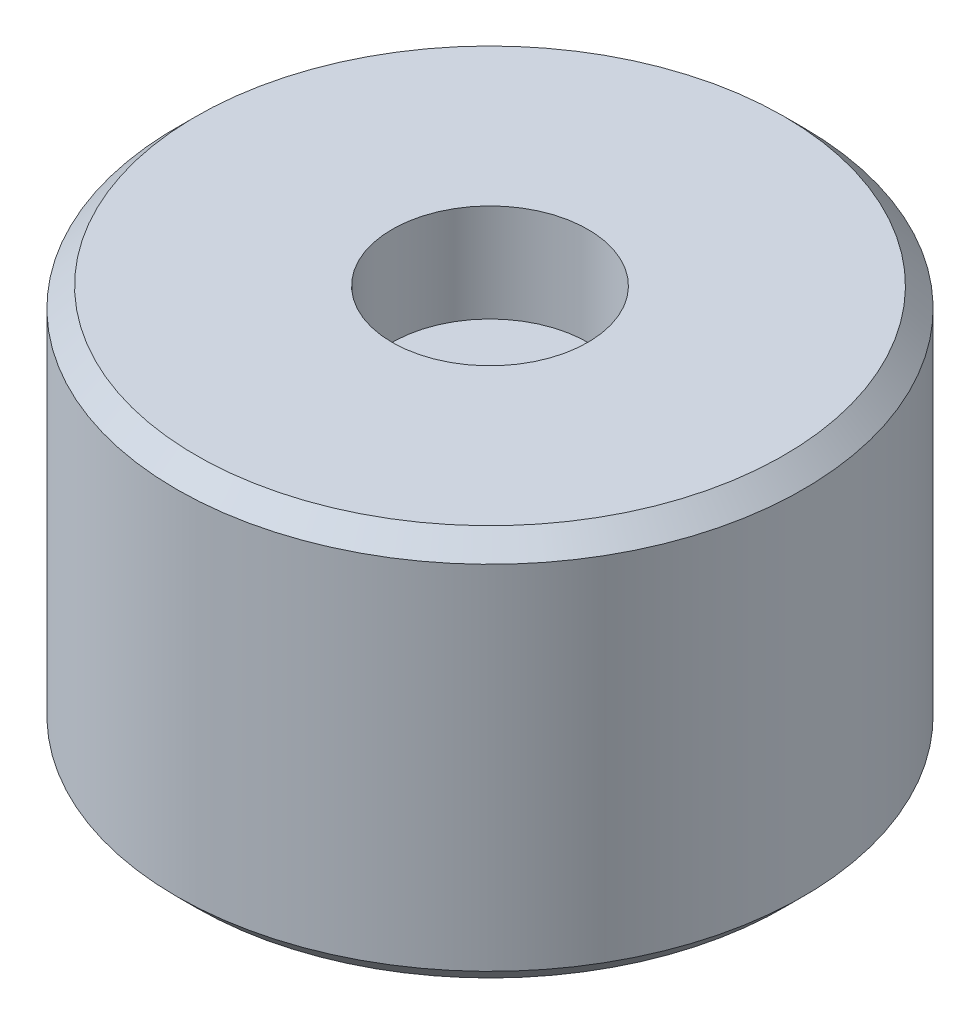
ISO-10303-21;
HEADER;
FILE_DESCRIPTION(('STEP AP214'),'2;1');
FILE_NAME('part.step','',(''),(''),'','','');
FILE_SCHEMA(('AUTOMOTIVE_DESIGN { 1 0 10303 214 1 1 1 1 }'));
ENDSEC;
DATA;
#1=APPLICATION_CONTEXT('core data for automotive mechanical design processes');
#2=APPLICATION_PROTOCOL_DEFINITION('international standard','automotive_design',2000,#1);
#3=PRODUCT_CONTEXT('',#1,'mechanical');
#4=PRODUCT('Part','Part','',(#3));
#5=PRODUCT_RELATED_PRODUCT_CATEGORY('part','',(#4));
#6=PRODUCT_DEFINITION_FORMATION('','',#4);
#7=PRODUCT_DEFINITION_CONTEXT('part definition',#1,'design');
#8=PRODUCT_DEFINITION('design','',#6,#7);
#9=PRODUCT_DEFINITION_SHAPE('','',#8);
#10=(LENGTH_UNIT() NAMED_UNIT(*) SI_UNIT(.MILLI.,.METRE.));
#11=(NAMED_UNIT(*) PLANE_ANGLE_UNIT() SI_UNIT($,.RADIAN.));
#12=(NAMED_UNIT(*) SI_UNIT($,.STERADIAN.) SOLID_ANGLE_UNIT());
#13=UNCERTAINTY_MEASURE_WITH_UNIT(LENGTH_MEASURE(1.E-05),#10,'distance_accuracy_value','');
#14=(GEOMETRIC_REPRESENTATION_CONTEXT(3) GLOBAL_UNCERTAINTY_ASSIGNED_CONTEXT((#13)) GLOBAL_UNIT_ASSIGNED_CONTEXT((#10,
#11,#12)) REPRESENTATION_CONTEXT('',''));
#15=CARTESIAN_POINT('',(0.,0.,0.));
#16=DIRECTION('',(0.,0.,1.));
#17=DIRECTION('',(1.,0.,0.));
#18=AXIS2_PLACEMENT_3D('',#15,#16,#17);
#19=CARTESIAN_POINT('',(0.,4.,0.));
#20=DIRECTION('',(0.,-1.,0.));
#21=DIRECTION('',(0.,0.,-1.));
#22=AXIS2_PLACEMENT_3D('',#19,#20,#21);
#23=CYLINDRICAL_SURFACE('',#22,3.2);
#24=CARTESIAN_POINT('',(0.,0.200000000000001,0.));
#25=DIRECTION('',(0.,1.,0.));
#26=DIRECTION('',(0.,0.,1.));
#27=AXIS2_PLACEMENT_3D('',#24,#25,#26);
#28=CIRCLE('',#27,3.2);
#29=CARTESIAN_POINT('',(0.,0.200000000000001,3.2));
#30=VERTEX_POINT('',#29);
#31=EDGE_CURVE('E148',#30,#30,#28,.T.);
#32=ORIENTED_EDGE('',*,*,#31,.T.);
#33=EDGE_LOOP('',(#32));
#34=FACE_BOUND('',#33,.T.);
#35=CARTESIAN_POINT('',(0.,3.8,0.));
#36=DIRECTION('',(0.,1.,0.));
#37=DIRECTION('',(0.,0.,1.));
#38=AXIS2_PLACEMENT_3D('',#35,#36,#37);
#39=CIRCLE('',#38,3.2);
#40=CARTESIAN_POINT('',(0.,3.8,-3.2));
#41=VERTEX_POINT('',#40);
#42=EDGE_CURVE('E141',#41,#41,#39,.F.);
#43=ORIENTED_EDGE('',*,*,#42,.T.);
#44=EDGE_LOOP('',(#43));
#45=FACE_BOUND('',#44,.T.);
#46=ADVANCED_FACE('F40',(#34,#45),#23,.T.);
#47=CARTESIAN_POINT('',(0.,4.,0.));
#48=DIRECTION('',(0.,1.,0.));
#49=DIRECTION('',(0.,0.,1.));
#50=AXIS2_PLACEMENT_3D('',#47,#48,#49);
#51=PLANE('',#50);
#52=CARTESIAN_POINT('',(0.,4.,0.));
#53=DIRECTION('',(0.,1.,0.));
#54=DIRECTION('',(0.,0.,1.));
#55=AXIS2_PLACEMENT_3D('',#52,#53,#54);
#56=CIRCLE('',#55,1.);
#57=CARTESIAN_POINT('',(0.,4.,1.));
#58=VERTEX_POINT('',#57);
#59=EDGE_CURVE('E132',#58,#58,#56,.T.);
#60=ORIENTED_EDGE('',*,*,#59,.F.);
#61=EDGE_LOOP('',(#60));
#62=FACE_BOUND('',#61,.T.);
#63=CARTESIAN_POINT('',(0.,4.,0.));
#64=DIRECTION('',(0.,1.,0.));
#65=DIRECTION('',(0.,0.,1.));
#66=AXIS2_PLACEMENT_3D('',#63,#64,#65);
#67=CIRCLE('',#66,3.);
#68=CARTESIAN_POINT('',(0.,4.,-3.));
#69=VERTEX_POINT('',#68);
#70=EDGE_CURVE('E11',#69,#69,#67,.T.);
#71=ORIENTED_EDGE('',*,*,#70,.T.);
#72=EDGE_LOOP('',(#71));
#73=FACE_BOUND('',#72,.T.);
#74=ADVANCED_FACE('F164',(#62,#73),#51,.T.);
#75=CARTESIAN_POINT('',(0.,0.,0.));
#76=DIRECTION('',(0.,1.,0.));
#77=DIRECTION('',(0.,0.,1.));
#78=AXIS2_PLACEMENT_3D('',#75,#76,#77);
#79=PLANE('',#78);
#80=CARTESIAN_POINT('',(0.,0.,0.));
#81=DIRECTION('',(0.,-1.,0.));
#82=DIRECTION('',(0.,0.,-1.));
#83=AXIS2_PLACEMENT_3D('',#80,#81,#82);
#84=CIRCLE('',#83,2.8);
#85=CARTESIAN_POINT('',(0.,0.,-2.8));
#86=VERTEX_POINT('',#85);
#87=EDGE_CURVE('E102',#86,#86,#84,.T.);
#88=ORIENTED_EDGE('',*,*,#87,.F.);
#89=EDGE_LOOP('',(#88));
#90=FACE_BOUND('',#89,.T.);
#91=CARTESIAN_POINT('',(0.,0.,0.));
#92=DIRECTION('',(0.,1.,0.));
#93=DIRECTION('',(0.,0.,1.));
#94=AXIS2_PLACEMENT_3D('',#91,#92,#93);
#95=CIRCLE('',#94,3.);
#96=CARTESIAN_POINT('',(0.,0.,3.));
#97=VERTEX_POINT('',#96);
#98=EDGE_CURVE('E49',#97,#97,#95,.F.);
#99=ORIENTED_EDGE('',*,*,#98,.T.);
#100=EDGE_LOOP('',(#99));
#101=FACE_BOUND('',#100,.T.);
#102=ADVANCED_FACE('F155',(#90,#101),#79,.F.);
#103=CARTESIAN_POINT('',(0.,0.200000000000001,0.));
#104=DIRECTION('',(0.,1.,0.));
#105=DIRECTION('',(0.,0.,1.));
#106=AXIS2_PLACEMENT_3D('',#103,#104,#105);
#107=CONICAL_SURFACE('',#106,3.2,0.785398163397449);
#108=ORIENTED_EDGE('',*,*,#98,.F.);
#109=EDGE_LOOP('',(#108));
#110=FACE_BOUND('',#109,.T.);
#111=ORIENTED_EDGE('',*,*,#31,.F.);
#112=EDGE_LOOP('',(#111));
#113=FACE_BOUND('',#112,.T.);
#114=ADVANCED_FACE('F157',(#110,#113),#107,.T.);
#115=CARTESIAN_POINT('',(0.,4.,0.));
#116=DIRECTION('',(0.,-1.,0.));
#117=DIRECTION('',(0.,0.,-1.));
#118=AXIS2_PLACEMENT_3D('',#115,#116,#117);
#119=CONICAL_SURFACE('',#118,3.,0.785398163397444);
#120=CARTESIAN_POINT('',(0.,3.8,-3.2));
#121=CARTESIAN_POINT('',(0.,3.80208333333333,-3.19791666666667));
#122=CARTESIAN_POINT('',(0.,3.80416666666667,-3.19583333333333));
#123=CARTESIAN_POINT('',(0.,3.80833333333333,-3.19166666666667));
#124=CARTESIAN_POINT('',(0.,3.81041666666667,-3.18958333333333));
#125=CARTESIAN_POINT('',(0.,3.81458333333333,-3.18541666666667));
#126=CARTESIAN_POINT('',(0.,3.81666666666667,-3.18333333333333));
#127=CARTESIAN_POINT('',(0.,3.82083333333333,-3.17916666666667));
#128=CARTESIAN_POINT('',(0.,3.82291666666667,-3.17708333333333));
#129=CARTESIAN_POINT('',(0.,3.82708333333333,-3.17291666666667));
#130=CARTESIAN_POINT('',(0.,3.82916666666667,-3.17083333333333));
#131=CARTESIAN_POINT('',(0.,3.83333333333333,-3.16666666666667));
#132=CARTESIAN_POINT('',(0.,3.83541666666667,-3.16458333333333));
#133=CARTESIAN_POINT('',(0.,3.83958333333333,-3.16041666666667));
#134=CARTESIAN_POINT('',(0.,3.84166666666667,-3.15833333333333));
#135=CARTESIAN_POINT('',(0.,3.84583333333333,-3.15416666666667));
#136=CARTESIAN_POINT('',(0.,3.84791666666667,-3.15208333333333));
#137=CARTESIAN_POINT('',(0.,3.85208333333333,-3.14791666666667));
#138=CARTESIAN_POINT('',(0.,3.85416666666667,-3.14583333333333));
#139=CARTESIAN_POINT('',(0.,3.85833333333333,-3.14166666666667));
#140=CARTESIAN_POINT('',(0.,3.86041666666667,-3.13958333333333));
#141=CARTESIAN_POINT('',(0.,3.86458333333333,-3.13541666666667));
#142=CARTESIAN_POINT('',(0.,3.86666666666667,-3.13333333333333));
#143=CARTESIAN_POINT('',(0.,3.87083333333333,-3.12916666666667));
#144=CARTESIAN_POINT('',(0.,3.87291666666667,-3.12708333333333));
#145=CARTESIAN_POINT('',(0.,3.87708333333333,-3.12291666666667));
#146=CARTESIAN_POINT('',(0.,3.87916666666667,-3.12083333333333));
#147=CARTESIAN_POINT('',(0.,3.88333333333333,-3.11666666666667));
#148=CARTESIAN_POINT('',(0.,3.88541666666667,-3.11458333333333));
#149=CARTESIAN_POINT('',(0.,3.88958333333333,-3.11041666666667));
#150=CARTESIAN_POINT('',(0.,3.89166666666667,-3.10833333333333));
#151=CARTESIAN_POINT('',(0.,3.89583333333333,-3.10416666666667));
#152=CARTESIAN_POINT('',(0.,3.89791666666667,-3.10208333333334));
#153=CARTESIAN_POINT('',(0.,3.90208333333333,-3.09791666666667));
#154=CARTESIAN_POINT('',(0.,3.90416666666667,-3.09583333333333));
#155=CARTESIAN_POINT('',(0.,3.90833333333333,-3.09166666666667));
#156=CARTESIAN_POINT('',(0.,3.91041666666667,-3.08958333333334));
#157=CARTESIAN_POINT('',(0.,3.91458333333333,-3.08541666666667));
#158=CARTESIAN_POINT('',(0.,3.91666666666667,-3.08333333333334));
#159=CARTESIAN_POINT('',(0.,3.92083333333333,-3.07916666666667));
#160=CARTESIAN_POINT('',(0.,3.92291666666667,-3.07708333333334));
#161=CARTESIAN_POINT('',(0.,3.92708333333333,-3.07291666666667));
#162=CARTESIAN_POINT('',(0.,3.92916666666667,-3.07083333333334));
#163=CARTESIAN_POINT('',(0.,3.93333333333333,-3.06666666666667));
#164=CARTESIAN_POINT('',(0.,3.93541666666667,-3.06458333333334));
#165=CARTESIAN_POINT('',(0.,3.93958333333333,-3.06041666666667));
#166=CARTESIAN_POINT('',(0.,3.94166666666667,-3.05833333333334));
#167=CARTESIAN_POINT('',(0.,3.94583333333333,-3.05416666666667));
#168=CARTESIAN_POINT('',(0.,3.94791666666667,-3.05208333333334));
#169=CARTESIAN_POINT('',(0.,3.95208333333333,-3.04791666666667));
#170=CARTESIAN_POINT('',(0.,3.95416666666667,-3.04583333333334));
#171=CARTESIAN_POINT('',(0.,3.95833333333333,-3.04166666666667));
#172=CARTESIAN_POINT('',(0.,3.96041666666667,-3.03958333333334));
#173=CARTESIAN_POINT('',(0.,3.96458333333333,-3.03541666666667));
#174=CARTESIAN_POINT('',(0.,3.96666666666667,-3.03333333333334));
#175=CARTESIAN_POINT('',(0.,3.97083333333333,-3.02916666666667));
#176=CARTESIAN_POINT('',(0.,3.97291666666667,-3.02708333333334));
#177=CARTESIAN_POINT('',(0.,3.97708333333333,-3.02291666666667));
#178=CARTESIAN_POINT('',(0.,3.97916666666667,-3.02083333333334));
#179=CARTESIAN_POINT('',(0.,3.98333333333333,-3.01666666666667));
#180=CARTESIAN_POINT('',(0.,3.98541666666667,-3.01458333333334));
#181=CARTESIAN_POINT('',(0.,3.98958333333333,-3.01041666666667));
#182=CARTESIAN_POINT('',(0.,3.99166666666667,-3.00833333333334));
#183=CARTESIAN_POINT('',(0.,3.99583333333333,-3.00416666666667));
#184=CARTESIAN_POINT('',(0.,3.99791666666667,-3.00208333333334));
#185=CARTESIAN_POINT('',(0.,4.,-3.));
#186=B_SPLINE_CURVE_WITH_KNOTS('',3,(#120,#121,#122,#123,#124,#125,#126,#127,#128,#129,#130,
#131,#132,#133,#134,#135,#136,#137,#138,#139,#140,#141,#142,#143,#144,#145,#146,#147,#148,#149,
#150,#151,#152,#153,#154,#155,#156,#157,#158,#159,#160,#161,#162,#163,#164,#165,#166,#167,#168,
#169,#170,#171,#172,#173,#174,#175,#176,#177,#178,#179,#180,#181,#182,#183,#184,#185),
.UNSPECIFIED.,.F.,.F.,(4,2,2,2,2,2,2,2,2,2,2,2,2,2,2,2,2,2,2,2,2,2,2,2,2,2,2,2,2,2,2,2,4),(0.,
0.00883883476483179,0.0176776695296636,0.0265165042944954,0.0353553390593272,0.0441941738241586,
0.0530330085889907,0.0618718433538222,0.0707106781186543,0.0795495128834858,0.0883883476483176,
0.0972271824131494,0.106066017177981,0.114904851942813,0.123743686707645,0.132582521472476,
0.141421356237308,0.15026019100214,0.159099025766972,0.167937860531804,0.176776695296635,
0.185615530061467,0.194454364826299,0.203293199591131,0.212132034355962,0.220970869120794,
0.229809703885626,0.238648538650458,0.247487373415289,0.256326208180121,0.265165042944953,
0.274003877709785,0.282842712474617),.UNSPECIFIED.);
#187=EDGE_CURVE('BSEAM42',#41,#69,#186,.T.);
#188=ORIENTED_EDGE('',*,*,#42,.F.);
#189=ORIENTED_EDGE('',*,*,#70,.F.);
#190=ORIENTED_EDGE('',*,*,#187,.T.);
#191=ORIENTED_EDGE('',*,*,#187,.F.);
#192=EDGE_LOOP('',(#188,#190,#189,#191));
#193=FACE_BOUND('',#192,.T.);
#194=ADVANCED_FACE('F42',(#193),#119,.T.);
#195=CARTESIAN_POINT('',(0.,3.,0.));
#196=DIRECTION('',(0.,1.,0.));
#197=DIRECTION('',(0.,0.,1.));
#198=AXIS2_PLACEMENT_3D('',#195,#196,#197);
#199=CYLINDRICAL_SURFACE('',#198,1.);
#200=CARTESIAN_POINT('',(0.,3.,0.));
#201=DIRECTION('',(0.,1.,0.));
#202=DIRECTION('',(0.,0.,1.));
#203=AXIS2_PLACEMENT_3D('',#200,#201,#202);
#204=CIRCLE('',#203,1.);
#205=CARTESIAN_POINT('',(0.,3.,1.));
#206=VERTEX_POINT('',#205);
#207=EDGE_CURVE('E137',#206,#206,#204,.T.);
#208=ORIENTED_EDGE('',*,*,#207,.F.);
#209=EDGE_LOOP('',(#208));
#210=FACE_BOUND('',#209,.T.);
#211=ORIENTED_EDGE('',*,*,#59,.T.);
#212=EDGE_LOOP('',(#211));
#213=FACE_BOUND('',#212,.T.);
#214=ADVANCED_FACE('F170',(#210,#213),#199,.F.);
#215=CARTESIAN_POINT('',(0.,3.,0.));
#216=DIRECTION('',(0.,1.,0.));
#217=DIRECTION('',(0.,0.,1.));
#218=AXIS2_PLACEMENT_3D('',#215,#216,#217);
#219=PLANE('',#218);
#220=ORIENTED_EDGE('',*,*,#207,.T.);
#221=EDGE_LOOP('',(#220));
#222=FACE_BOUND('',#221,.T.);
#223=ADVANCED_FACE('F187',(#222),#219,.T.);
#224=CARTESIAN_POINT('',(0.,0.2,0.));
#225=DIRECTION('',(0.,-1.,0.));
#226=DIRECTION('',(0.,0.,-1.));
#227=AXIS2_PLACEMENT_3D('',#224,#225,#226);
#228=CYLINDRICAL_SURFACE('',#227,1.525);
#229=CARTESIAN_POINT('',(0.,0.,0.));
#230=DIRECTION('',(0.,-1.,0.));
#231=DIRECTION('',(0.,0.,-1.));
#232=AXIS2_PLACEMENT_3D('',#229,#230,#231);
#233=CIRCLE('',#232,1.525);
#234=CARTESIAN_POINT('',(-0.634999999999999,0.,1.38650640099496));
#235=VERTEX_POINT('',#234);
#236=CARTESIAN_POINT('',(-0.634999999999999,0.,-1.38650640099496));
#237=VERTEX_POINT('',#236);
#238=EDGE_CURVE('E56',#235,#237,#233,.T.);
#239=ORIENTED_EDGE('',*,*,#238,.F.);
#240=DIRECTION('',(0.,-1.,0.));
#241=VECTOR('',#240,1.);
#242=CARTESIAN_POINT('',(-0.634999999999999,0.2,1.38650640099496));
#243=LINE('',#242,#241);
#244=CARTESIAN_POINT('',(-0.634999999999999,0.2,1.38650640099496));
#245=VERTEX_POINT('',#244);
#246=EDGE_CURVE('E133',#245,#235,#243,.T.);
#247=ORIENTED_EDGE('',*,*,#246,.F.);
#248=CARTESIAN_POINT('',(0.,0.2,0.));
#249=DIRECTION('',(0.,-1.,0.));
#250=DIRECTION('',(0.,0.,-1.));
#251=AXIS2_PLACEMENT_3D('',#248,#249,#250);
#252=CIRCLE('',#251,1.525);
#253=CARTESIAN_POINT('',(-0.634999999999999,0.2,-1.38650640099496));
#254=VERTEX_POINT('',#253);
#255=EDGE_CURVE('E92',#245,#254,#252,.T.);
#256=ORIENTED_EDGE('',*,*,#255,.T.);
#257=DIRECTION('',(0.,-1.,0.));
#258=VECTOR('',#257,1.);
#259=CARTESIAN_POINT('',(-0.634999999999999,0.2,-1.38650640099496));
#260=LINE('',#259,#258);
#261=EDGE_CURVE('E129',#254,#237,#260,.T.);
#262=ORIENTED_EDGE('',*,*,#261,.T.);
#263=EDGE_LOOP('',(#239,#247,#256,#262));
#264=FACE_BOUND('',#263,.T.);
#265=ADVANCED_FACE('F191',(#264),#228,.T.);
#266=CARTESIAN_POINT('',(0.,0.2,0.));
#267=DIRECTION('',(0.,-1.,0.));
#268=DIRECTION('',(0.,0.,-1.));
#269=AXIS2_PLACEMENT_3D('',#266,#267,#268);
#270=CYLINDRICAL_SURFACE('',#269,1.525);
#271=CARTESIAN_POINT('',(0.,0.,0.));
#272=DIRECTION('',(0.,-1.,0.));
#273=DIRECTION('',(0.,0.,-1.));
#274=AXIS2_PLACEMENT_3D('',#271,#272,#273);
#275=CIRCLE('',#274,1.525);
#276=CARTESIAN_POINT('',(0.634999999999999,0.,-1.38650640099496));
#277=VERTEX_POINT('',#276);
#278=CARTESIAN_POINT('',(0.634999999999999,0.,1.38650640099496));
#279=VERTEX_POINT('',#278);
#280=EDGE_CURVE('E64',#277,#279,#275,.T.);
#281=ORIENTED_EDGE('',*,*,#280,.F.);
#282=DIRECTION('',(0.,-1.,0.));
#283=VECTOR('',#282,1.);
#284=CARTESIAN_POINT('',(0.634999999999999,0.2,-1.38650640099496));
#285=LINE('',#284,#283);
#286=CARTESIAN_POINT('',(0.634999999999999,0.2,-1.38650640099496));
#287=VERTEX_POINT('',#286);
#288=EDGE_CURVE('E85',#287,#277,#285,.T.);
#289=ORIENTED_EDGE('',*,*,#288,.F.);
#290=CARTESIAN_POINT('',(0.,0.2,0.));
#291=DIRECTION('',(0.,-1.,0.));
#292=DIRECTION('',(0.,0.,-1.));
#293=AXIS2_PLACEMENT_3D('',#290,#291,#292);
#294=CIRCLE('',#293,1.525);
#295=CARTESIAN_POINT('',(0.634999999999999,0.2,1.38650640099496));
#296=VERTEX_POINT('',#295);
#297=EDGE_CURVE('E93',#287,#296,#294,.T.);
#298=ORIENTED_EDGE('',*,*,#297,.T.);
#299=DIRECTION('',(0.,-1.,0.));
#300=VECTOR('',#299,1.);
#301=CARTESIAN_POINT('',(0.634999999999999,0.2,1.38650640099496));
#302=LINE('',#301,#300);
#303=EDGE_CURVE('E87',#296,#279,#302,.T.);
#304=ORIENTED_EDGE('',*,*,#303,.T.);
#305=EDGE_LOOP('',(#281,#289,#298,#304));
#306=FACE_BOUND('',#305,.T.);
#307=ADVANCED_FACE('F95',(#306),#270,.T.);
#308=CARTESIAN_POINT('',(-0.634999999999999,0.2,0.));
#309=DIRECTION('',(-1.,0.,0.));
#310=DIRECTION('',(0.,0.,1.));
#311=AXIS2_PLACEMENT_3D('',#308,#309,#310);
#312=PLANE('',#311);
#313=DIRECTION('',(0.,0.,-1.));
#314=VECTOR('',#313,1.);
#315=CARTESIAN_POINT('',(-0.634999999999999,0.,0.));
#316=LINE('',#315,#314);
#317=EDGE_CURVE('E107',#235,#237,#316,.T.);
#318=ORIENTED_EDGE('',*,*,#317,.T.);
#319=ORIENTED_EDGE('',*,*,#261,.F.);
#320=DIRECTION('',(0.,0.,-1.));
#321=VECTOR('',#320,1.);
#322=CARTESIAN_POINT('',(-0.634999999999999,0.2,0.));
#323=LINE('',#322,#321);
#324=EDGE_CURVE('E112',#245,#254,#323,.T.);
#325=ORIENTED_EDGE('',*,*,#324,.F.);
#326=ORIENTED_EDGE('',*,*,#246,.T.);
#327=EDGE_LOOP('',(#318,#319,#325,#326));
#328=FACE_BOUND('',#327,.T.);
#329=ADVANCED_FACE('F195',(#328),#312,.F.);
#330=CARTESIAN_POINT('',(0.634999999999999,0.2,0.));
#331=DIRECTION('',(-1.,0.,0.));
#332=DIRECTION('',(0.,0.,1.));
#333=AXIS2_PLACEMENT_3D('',#330,#331,#332);
#334=PLANE('',#333);
#335=DIRECTION('',(0.,0.,-1.));
#336=VECTOR('',#335,1.);
#337=CARTESIAN_POINT('',(0.634999999999999,0.,0.));
#338=LINE('',#337,#336);
#339=EDGE_CURVE('E121',#279,#277,#338,.T.);
#340=ORIENTED_EDGE('',*,*,#339,.F.);
#341=ORIENTED_EDGE('',*,*,#303,.F.);
#342=DIRECTION('',(0.,0.,-1.));
#343=VECTOR('',#342,1.);
#344=CARTESIAN_POINT('',(0.634999999999999,0.2,0.));
#345=LINE('',#344,#343);
#346=EDGE_CURVE('E83',#296,#287,#345,.T.);
#347=ORIENTED_EDGE('',*,*,#346,.T.);
#348=ORIENTED_EDGE('',*,*,#288,.T.);
#349=EDGE_LOOP('',(#340,#341,#347,#348));
#350=FACE_BOUND('',#349,.T.);
#351=ADVANCED_FACE('F84',(#350),#334,.T.);
#352=CARTESIAN_POINT('',(0.,0.2,0.));
#353=DIRECTION('',(0.,-1.,0.));
#354=DIRECTION('',(0.,0.,-1.));
#355=AXIS2_PLACEMENT_3D('',#352,#353,#354);
#356=CYLINDRICAL_SURFACE('',#355,2.8);
#357=CARTESIAN_POINT('',(0.,0.2,0.));
#358=DIRECTION('',(0.,-1.,0.));
#359=DIRECTION('',(0.,0.,-1.));
#360=AXIS2_PLACEMENT_3D('',#357,#358,#359);
#361=CIRCLE('',#360,2.8);
#362=CARTESIAN_POINT('',(0.,0.2,-2.8));
#363=VERTEX_POINT('',#362);
#364=EDGE_CURVE('E97',#363,#363,#361,.T.);
#365=ORIENTED_EDGE('',*,*,#364,.F.);
#366=EDGE_LOOP('',(#365));
#367=FACE_BOUND('',#366,.T.);
#368=ORIENTED_EDGE('',*,*,#87,.T.);
#369=EDGE_LOOP('',(#368));
#370=FACE_BOUND('',#369,.T.);
#371=ADVANCED_FACE('F198',(#367,#370),#356,.F.);
#372=CARTESIAN_POINT('',(0.,0.2,0.));
#373=DIRECTION('',(0.,-1.,0.));
#374=DIRECTION('',(0.,0.,-1.));
#375=AXIS2_PLACEMENT_3D('',#372,#373,#374);
#376=PLANE('',#375);
#377=ORIENTED_EDGE('',*,*,#297,.F.);
#378=ORIENTED_EDGE('',*,*,#346,.F.);
#379=EDGE_LOOP('',(#377,#378));
#380=FACE_BOUND('',#379,.T.);
#381=ORIENTED_EDGE('',*,*,#255,.F.);
#382=ORIENTED_EDGE('',*,*,#324,.T.);
#383=EDGE_LOOP('',(#381,#382));
#384=FACE_BOUND('',#383,.T.);
#385=ORIENTED_EDGE('',*,*,#364,.T.);
#386=EDGE_LOOP('',(#385));
#387=FACE_BOUND('',#386,.T.);
#388=ADVANCED_FACE('F99',(#380,#384,#387),#376,.T.);
#389=ORIENTED_EDGE('',*,*,#280,.T.);
#390=ORIENTED_EDGE('',*,*,#339,.T.);
#391=EDGE_LOOP('',(#389,#390));
#392=FACE_BOUND('',#391,.T.);
#393=ADVANCED_FACE('F182',(#392),#79,.F.);
#394=ORIENTED_EDGE('',*,*,#238,.T.);
#395=ORIENTED_EDGE('',*,*,#317,.F.);
#396=EDGE_LOOP('',(#394,#395));
#397=FACE_BOUND('',#396,.T.);
#398=ADVANCED_FACE('F181',(#397),#79,.F.);
#399=CLOSED_SHELL('',(#46,#74,#102,#114,#194,#214,#223,#265,#307,#329,#351,#371,#388,#393,#398));
#400=MANIFOLD_SOLID_BREP('B2',#399);
#401=ADVANCED_BREP_SHAPE_REPRESENTATION('',(#18,#400),#14);
#402=SHAPE_DEFINITION_REPRESENTATION(#9,#401);
ENDSEC;
END-ISO-10303-21;
